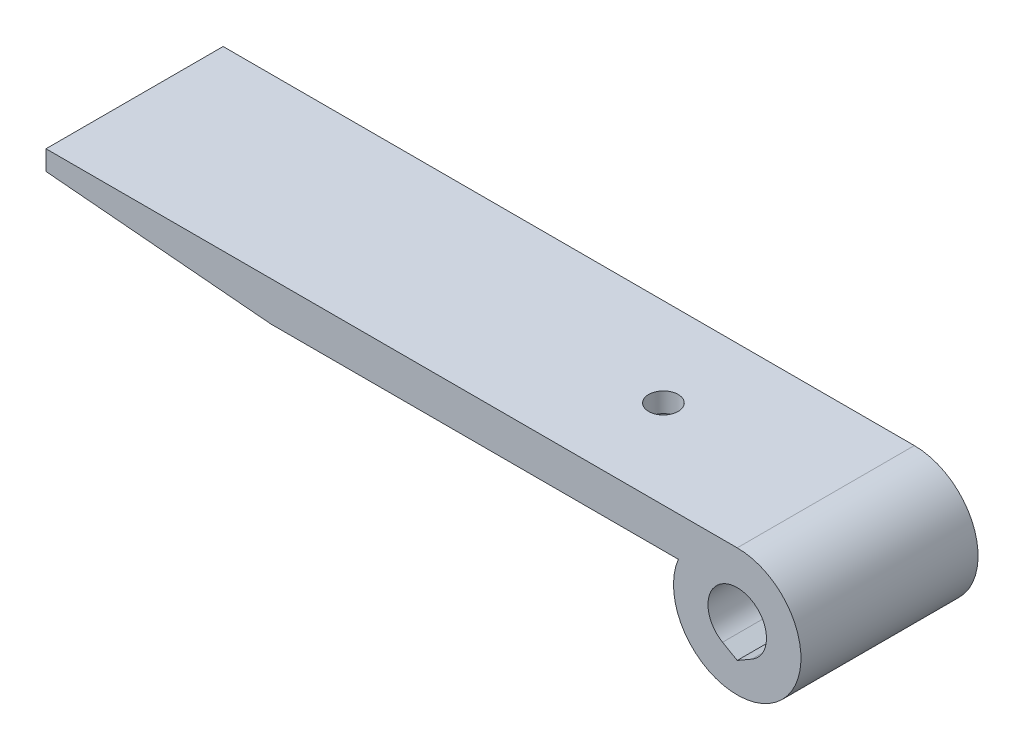
ISO-10303-21;
HEADER;
FILE_DESCRIPTION(('STEP AP214'),'2;1');
FILE_NAME('part.step','',(''),(''),'','','');
FILE_SCHEMA(('AUTOMOTIVE_DESIGN { 1 0 10303 214 1 1 1 1 }'));
ENDSEC;
DATA;
#1=APPLICATION_CONTEXT('core data for automotive mechanical design processes');
#2=APPLICATION_PROTOCOL_DEFINITION('international standard','automotive_design',2000,#1);
#3=PRODUCT_CONTEXT('',#1,'mechanical');
#4=PRODUCT('Part','Part','',(#3));
#5=PRODUCT_RELATED_PRODUCT_CATEGORY('part','',(#4));
#6=PRODUCT_DEFINITION_FORMATION('','',#4);
#7=PRODUCT_DEFINITION_CONTEXT('part definition',#1,'design');
#8=PRODUCT_DEFINITION('design','',#6,#7);
#9=PRODUCT_DEFINITION_SHAPE('','',#8);
#10=(LENGTH_UNIT() NAMED_UNIT(*) SI_UNIT(.MILLI.,.METRE.));
#11=(NAMED_UNIT(*) PLANE_ANGLE_UNIT() SI_UNIT($,.RADIAN.));
#12=(NAMED_UNIT(*) SI_UNIT($,.STERADIAN.) SOLID_ANGLE_UNIT());
#13=UNCERTAINTY_MEASURE_WITH_UNIT(LENGTH_MEASURE(1.E-05),#10,'distance_accuracy_value','');
#14=(GEOMETRIC_REPRESENTATION_CONTEXT(3) GLOBAL_UNCERTAINTY_ASSIGNED_CONTEXT((#13)) GLOBAL_UNIT_ASSIGNED_CONTEXT((#10,
#11,#12)) REPRESENTATION_CONTEXT('',''));
#15=CARTESIAN_POINT('',(0.,0.,0.));
#16=DIRECTION('',(0.,0.,1.));
#17=DIRECTION('',(1.,0.,0.));
#18=AXIS2_PLACEMENT_3D('',#15,#16,#17);
#19=CARTESIAN_POINT('',(0.,4.47499999999999,9.));
#20=DIRECTION('',(0.,1.,0.));
#21=DIRECTION('',(-1.,0.,0.));
#22=AXIS2_PLACEMENT_3D('',#19,#20,#21);
#23=PLANE('',#22);
#24=CARTESIAN_POINT('',(-16.5,4.47499999999999,0.));
#25=DIRECTION('',(0.,-1.,0.));
#26=DIRECTION('',(1.,0.,0.));
#27=AXIS2_PLACEMENT_3D('',#24,#25,#26);
#28=CIRCLE('',#27,1.5);
#29=CARTESIAN_POINT('',(-15.,4.47499999999999,0.));
#30=VERTEX_POINT('',#29);
#31=EDGE_CURVE('E256',#30,#30,#28,.T.);
#32=ORIENTED_EDGE('',*,*,#31,.F.);
#33=EDGE_LOOP('',(#32));
#34=FACE_BOUND('',#33,.T.);
#35=CARTESIAN_POINT('',(-16.5,4.47499999999999,0.));
#36=DIRECTION('',(0.,-1.,0.));
#37=DIRECTION('',(1.,0.,0.));
#38=AXIS2_PLACEMENT_3D('',#35,#36,#37);
#39=CIRCLE('',#38,4.05);
#40=CARTESIAN_POINT('',(-12.45,4.47499999999999,0.));
#41=VERTEX_POINT('',#40);
#42=EDGE_CURVE('E264',#41,#41,#39,.T.);
#43=ORIENTED_EDGE('',*,*,#42,.T.);
#44=EDGE_LOOP('',(#43));
#45=FACE_BOUND('',#44,.T.);
#46=ADVANCED_FACE('F38',(#34,#45),#23,.F.);
#47=CARTESIAN_POINT('',(0.,0.,9.));
#48=DIRECTION('',(0.,0.,-1.));
#49=DIRECTION('',(-1.,0.,0.));
#50=AXIS2_PLACEMENT_3D('',#47,#48,#49);
#51=CYLINDRICAL_SURFACE('',#50,6.475);
#52=DIRECTION('',(0.,0.,1.));
#53=VECTOR('',#52,1.);
#54=CARTESIAN_POINT('',(-5.98331012066064,2.47499999999999,7.));
#55=LINE('',#54,#53);
#56=CARTESIAN_POINT('',(-5.98331012066064,2.47499999999999,7.));
#57=VERTEX_POINT('',#56);
#58=CARTESIAN_POINT('',(-5.98331012066064,2.47499999999999,9.));
#59=VERTEX_POINT('',#58);
#60=EDGE_CURVE('E130',#57,#59,#55,.T.);
#61=ORIENTED_EDGE('',*,*,#60,.F.);
#62=CARTESIAN_POINT('',(0.,0.,7.));
#63=DIRECTION('',(0.,0.,1.));
#64=DIRECTION('',(1.,0.,0.));
#65=AXIS2_PLACEMENT_3D('',#62,#63,#64);
#66=CIRCLE('',#65,6.475);
#67=CARTESIAN_POINT('',(-4.67974358271905,4.47499999999999,7.));
#68=VERTEX_POINT('',#67);
#69=EDGE_CURVE('E137',#68,#57,#66,.T.);
#70=ORIENTED_EDGE('',*,*,#69,.F.);
#71=DIRECTION('',(0.,0.,-1.));
#72=VECTOR('',#71,1.);
#73=CARTESIAN_POINT('',(-4.67974358271905,4.47499999999999,9.));
#74=LINE('',#73,#72);
#75=CARTESIAN_POINT('',(-4.67974358271905,4.47499999999999,-7.));
#76=VERTEX_POINT('',#75);
#77=EDGE_CURVE('E46',#68,#76,#74,.T.);
#78=ORIENTED_EDGE('',*,*,#77,.T.);
#79=CARTESIAN_POINT('',(0.,0.,-7.));
#80=DIRECTION('',(0.,0.,1.));
#81=DIRECTION('',(1.,0.,0.));
#82=AXIS2_PLACEMENT_3D('',#79,#80,#81);
#83=CIRCLE('',#82,6.475);
#84=CARTESIAN_POINT('',(-5.98331012066064,2.47499999999999,-7.));
#85=VERTEX_POINT('',#84);
#86=EDGE_CURVE('E53',#76,#85,#83,.T.);
#87=ORIENTED_EDGE('',*,*,#86,.T.);
#88=DIRECTION('',(0.,0.,-1.));
#89=VECTOR('',#88,1.);
#90=CARTESIAN_POINT('',(-5.98331012066064,2.47499999999999,-7.));
#91=LINE('',#90,#89);
#92=CARTESIAN_POINT('',(-5.98331012066064,2.47499999999999,-9.));
#93=VERTEX_POINT('',#92);
#94=EDGE_CURVE('E169',#85,#93,#91,.T.);
#95=ORIENTED_EDGE('',*,*,#94,.T.);
#96=CARTESIAN_POINT('',(0.,0.,-9.));
#97=DIRECTION('',(0.,0.,1.));
#98=DIRECTION('',(1.,0.,0.));
#99=AXIS2_PLACEMENT_3D('',#96,#97,#98);
#100=CIRCLE('',#99,6.475);
#101=CARTESIAN_POINT('',(0.,6.475,-9.));
#102=VERTEX_POINT('',#101);
#103=EDGE_CURVE('E194',#93,#102,#100,.T.);
#104=ORIENTED_EDGE('',*,*,#103,.T.);
#105=DIRECTION('',(0.,0.,-1.));
#106=VECTOR('',#105,1.);
#107=CARTESIAN_POINT('',(0.,6.475,9.));
#108=LINE('',#107,#106);
#109=CARTESIAN_POINT('',(0.,6.475,9.));
#110=VERTEX_POINT('',#109);
#111=EDGE_CURVE('E206',#110,#102,#108,.T.);
#112=ORIENTED_EDGE('',*,*,#111,.F.);
#113=CARTESIAN_POINT('',(0.,0.,9.));
#114=DIRECTION('',(0.,0.,1.));
#115=DIRECTION('',(1.,0.,0.));
#116=AXIS2_PLACEMENT_3D('',#113,#114,#115);
#117=CIRCLE('',#116,6.475);
#118=EDGE_CURVE('E146',#59,#110,#117,.T.);
#119=ORIENTED_EDGE('',*,*,#118,.F.);
#120=EDGE_LOOP('',(#61,#70,#78,#87,#95,#104,#112,#119));
#121=FACE_BOUND('',#120,.T.);
#122=ADVANCED_FACE('F144',(#121),#51,.T.);
#123=CARTESIAN_POINT('',(-16.5,4.47499999999999,0.));
#124=DIRECTION('',(0.,1.,0.));
#125=DIRECTION('',(-1.,0.,0.));
#126=AXIS2_PLACEMENT_3D('',#123,#124,#125);
#127=CIRCLE('',#126,6.95);
#128=CARTESIAN_POINT('',(-23.45,4.47499999999999,0.));
#129=VERTEX_POINT('',#128);
#130=EDGE_CURVE('E11',#129,#129,#127,.F.);
#131=ORIENTED_EDGE('',*,*,#130,.F.);
#132=EDGE_LOOP('',(#131));
#133=FACE_BOUND('',#132,.T.);
#134=DIRECTION('',(-1.,0.,0.));
#135=VECTOR('',#134,1.);
#136=CARTESIAN_POINT('',(0.,4.47499999999999,7.));
#137=LINE('',#136,#135);
#138=CARTESIAN_POINT('',(-70.2404,4.47499999999999,7.));
#139=VERTEX_POINT('',#138);
#140=EDGE_CURVE('E141',#68,#139,#137,.T.);
#141=ORIENTED_EDGE('',*,*,#140,.T.);
#142=DIRECTION('',(0.,0.,-1.));
#143=VECTOR('',#142,1.);
#144=CARTESIAN_POINT('',(-70.2404,4.47499999999999,9.));
#145=LINE('',#144,#143);
#146=CARTESIAN_POINT('',(-70.2404,4.47499999999999,-7.));
#147=VERTEX_POINT('',#146);
#148=EDGE_CURVE('E203',#139,#147,#145,.T.);
#149=ORIENTED_EDGE('',*,*,#148,.T.);
#150=DIRECTION('',(1.,0.,0.));
#151=VECTOR('',#150,1.);
#152=CARTESIAN_POINT('',(0.,4.47499999999999,-7.));
#153=LINE('',#152,#151);
#154=EDGE_CURVE('E158',#147,#76,#153,.T.);
#155=ORIENTED_EDGE('',*,*,#154,.T.);
#156=ORIENTED_EDGE('',*,*,#77,.F.);
#157=EDGE_LOOP('',(#141,#149,#155,#156));
#158=FACE_BOUND('',#157,.T.);
#159=ADVANCED_FACE('F220',(#133,#158),#23,.F.);
#160=CARTESIAN_POINT('',(0.,6.475,9.));
#161=DIRECTION('',(0.,-1.,0.));
#162=DIRECTION('',(1.,0.,0.));
#163=AXIS2_PLACEMENT_3D('',#160,#161,#162);
#164=PLANE('',#163);
#165=CARTESIAN_POINT('',(-16.5,6.475,0.));
#166=DIRECTION('',(0.,-1.,0.));
#167=DIRECTION('',(1.,0.,0.));
#168=AXIS2_PLACEMENT_3D('',#165,#166,#167);
#169=CIRCLE('',#168,1.5);
#170=CARTESIAN_POINT('',(-15.,6.475,0.));
#171=VERTEX_POINT('',#170);
#172=EDGE_CURVE('E253',#171,#171,#169,.T.);
#173=ORIENTED_EDGE('',*,*,#172,.T.);
#174=EDGE_LOOP('',(#173));
#175=FACE_BOUND('',#174,.T.);
#176=DIRECTION('',(-1.,0.,0.));
#177=VECTOR('',#176,1.);
#178=CARTESIAN_POINT('',(0.,6.475,-9.));
#179=LINE('',#178,#177);
#180=CARTESIAN_POINT('',(-70.2404,6.47499999999999,-9.));
#181=VERTEX_POINT('',#180);
#182=EDGE_CURVE('E196',#102,#181,#179,.T.);
#183=ORIENTED_EDGE('',*,*,#182,.T.);
#184=DIRECTION('',(0.,0.,-1.));
#185=VECTOR('',#184,1.);
#186=CARTESIAN_POINT('',(-70.2404,6.47499999999999,9.));
#187=LINE('',#186,#185);
#188=CARTESIAN_POINT('',(-70.2404,6.47499999999999,9.));
#189=VERTEX_POINT('',#188);
#190=EDGE_CURVE('E202',#189,#181,#187,.T.);
#191=ORIENTED_EDGE('',*,*,#190,.F.);
#192=DIRECTION('',(-1.,0.,0.));
#193=VECTOR('',#192,1.);
#194=CARTESIAN_POINT('',(0.,6.475,9.));
#195=LINE('',#194,#193);
#196=EDGE_CURVE('E181',#110,#189,#195,.T.);
#197=ORIENTED_EDGE('',*,*,#196,.F.);
#198=ORIENTED_EDGE('',*,*,#111,.T.);
#199=EDGE_LOOP('',(#183,#191,#197,#198));
#200=FACE_BOUND('',#199,.T.);
#201=ADVANCED_FACE('F245',(#175,#200),#164,.F.);
#202=CARTESIAN_POINT('',(0.,0.,9.));
#203=DIRECTION('',(0.,0.,-1.));
#204=DIRECTION('',(-1.,0.,0.));
#205=AXIS2_PLACEMENT_3D('',#202,#203,#204);
#206=CYLINDRICAL_SURFACE('',#205,2.975);
#207=CARTESIAN_POINT('',(0.,0.,-9.));
#208=DIRECTION('',(0.,0.,1.));
#209=DIRECTION('',(1.,0.,0.));
#210=AXIS2_PLACEMENT_3D('',#207,#208,#209);
#211=CIRCLE('',#210,2.975);
#212=CARTESIAN_POINT('',(1.4875,-2.5764255762587,-9.));
#213=VERTEX_POINT('',#212);
#214=CARTESIAN_POINT('',(-1.4875,-2.5764255762587,-9.));
#215=VERTEX_POINT('',#214);
#216=EDGE_CURVE('E171',#213,#215,#211,.T.);
#217=ORIENTED_EDGE('',*,*,#216,.F.);
#218=DIRECTION('',(0.,0.,-1.));
#219=VECTOR('',#218,1.);
#220=CARTESIAN_POINT('',(1.4875,-2.5764255762587,9.));
#221=LINE('',#220,#219);
#222=CARTESIAN_POINT('',(1.4875,-2.5764255762587,9.));
#223=VERTEX_POINT('',#222);
#224=EDGE_CURVE('E213',#223,#213,#221,.T.);
#225=ORIENTED_EDGE('',*,*,#224,.F.);
#226=CARTESIAN_POINT('',(0.,0.,9.));
#227=DIRECTION('',(0.,0.,1.));
#228=DIRECTION('',(1.,0.,0.));
#229=AXIS2_PLACEMENT_3D('',#226,#227,#228);
#230=CIRCLE('',#229,2.975);
#231=CARTESIAN_POINT('',(-1.4875,-2.5764255762587,9.));
#232=VERTEX_POINT('',#231);
#233=EDGE_CURVE('E172',#223,#232,#230,.T.);
#234=ORIENTED_EDGE('',*,*,#233,.T.);
#235=DIRECTION('',(0.,0.,-1.));
#236=VECTOR('',#235,1.);
#237=CARTESIAN_POINT('',(-1.4875,-2.5764255762587,9.));
#238=LINE('',#237,#236);
#239=EDGE_CURVE('E186',#232,#215,#238,.T.);
#240=ORIENTED_EDGE('',*,*,#239,.T.);
#241=EDGE_LOOP('',(#217,#225,#234,#240));
#242=FACE_BOUND('',#241,.T.);
#243=ADVANCED_FACE('F40',(#242),#206,.F.);
#244=CARTESIAN_POINT('',(1.4875,-2.5764255762587,9.));
#245=DIRECTION('',(0.500000000000001,-0.866025403784438,0.));
#246=DIRECTION('',(0.866025403784438,0.500000000000001,0.));
#247=AXIS2_PLACEMENT_3D('',#244,#245,#246);
#248=PLANE('',#247);
#249=DIRECTION('',(-0.866025403784438,-0.500000000000001,0.));
#250=VECTOR('',#249,1.);
#251=CARTESIAN_POINT('',(1.4875,-2.5764255762587,-9.));
#252=LINE('',#251,#250);
#253=CARTESIAN_POINT('',(0.,-3.43523410167828,-9.));
#254=VERTEX_POINT('',#253);
#255=EDGE_CURVE('E189',#213,#254,#252,.T.);
#256=ORIENTED_EDGE('',*,*,#255,.T.);
#257=DIRECTION('',(0.,0.,-1.));
#258=VECTOR('',#257,1.);
#259=CARTESIAN_POINT('',(0.,-3.43523410167828,9.));
#260=LINE('',#259,#258);
#261=CARTESIAN_POINT('',(0.,-3.43523410167828,9.));
#262=VERTEX_POINT('',#261);
#263=EDGE_CURVE('E211',#262,#254,#260,.T.);
#264=ORIENTED_EDGE('',*,*,#263,.F.);
#265=DIRECTION('',(-0.866025403784438,-0.500000000000001,0.));
#266=VECTOR('',#265,1.);
#267=CARTESIAN_POINT('',(1.4875,-2.5764255762587,9.));
#268=LINE('',#267,#266);
#269=EDGE_CURVE('E175',#223,#262,#268,.T.);
#270=ORIENTED_EDGE('',*,*,#269,.F.);
#271=ORIENTED_EDGE('',*,*,#224,.T.);
#272=EDGE_LOOP('',(#256,#264,#270,#271));
#273=FACE_BOUND('',#272,.T.);
#274=ADVANCED_FACE('F337',(#273),#248,.F.);
#275=CARTESIAN_POINT('',(-1.4875,-2.5764255762587,9.));
#276=DIRECTION('',(-0.500000000000001,-0.866025403784438,0.));
#277=DIRECTION('',(0.866025403784438,-0.500000000000001,0.));
#278=AXIS2_PLACEMENT_3D('',#275,#276,#277);
#279=PLANE('',#278);
#280=DIRECTION('',(-0.866025403784438,0.500000000000001,0.));
#281=VECTOR('',#280,1.);
#282=CARTESIAN_POINT('',(-1.4875,-2.5764255762587,-9.));
#283=LINE('',#282,#281);
#284=EDGE_CURVE('E191',#254,#215,#283,.T.);
#285=ORIENTED_EDGE('',*,*,#284,.T.);
#286=ORIENTED_EDGE('',*,*,#239,.F.);
#287=DIRECTION('',(-0.866025403784438,0.500000000000001,0.));
#288=VECTOR('',#287,1.);
#289=CARTESIAN_POINT('',(-1.4875,-2.5764255762587,9.));
#290=LINE('',#289,#288);
#291=EDGE_CURVE('E178',#262,#232,#290,.T.);
#292=ORIENTED_EDGE('',*,*,#291,.F.);
#293=ORIENTED_EDGE('',*,*,#263,.T.);
#294=EDGE_LOOP('',(#285,#286,#292,#293));
#295=FACE_BOUND('',#294,.T.);
#296=ADVANCED_FACE('F333',(#295),#279,.F.);
#297=CARTESIAN_POINT('',(-70.2404,0.,9.));
#298=DIRECTION('',(1.,0.,0.));
#299=DIRECTION('',(0.,0.,-1.));
#300=AXIS2_PLACEMENT_3D('',#297,#298,#299);
#301=PLANE('',#300);
#302=DIRECTION('',(0.,-1.,0.));
#303=VECTOR('',#302,1.);
#304=CARTESIAN_POINT('',(-70.2404,0.,-9.));
#305=LINE('',#304,#303);
#306=CARTESIAN_POINT('',(-70.2404,4.47499999999999,-9.));
#307=VERTEX_POINT('',#306);
#308=EDGE_CURVE('E176',#181,#307,#305,.T.);
#309=ORIENTED_EDGE('',*,*,#308,.T.);
#310=DIRECTION('',(0.,0.,-1.));
#311=VECTOR('',#310,1.);
#312=CARTESIAN_POINT('',(-70.2404,4.47499999999999,-7.));
#313=LINE('',#312,#311);
#314=EDGE_CURVE('E166',#147,#307,#313,.T.);
#315=ORIENTED_EDGE('',*,*,#314,.F.);
#316=ORIENTED_EDGE('',*,*,#148,.F.);
#317=CARTESIAN_POINT('',(-70.2404,4.47499999999999,9.));
#318=VERTEX_POINT('',#317);
#319=EDGE_CURVE('E199',#318,#139,#145,.T.);
#320=ORIENTED_EDGE('',*,*,#319,.F.);
#321=DIRECTION('',(0.,-1.,0.));
#322=VECTOR('',#321,1.);
#323=CARTESIAN_POINT('',(-70.2404,0.,9.));
#324=LINE('',#323,#322);
#325=EDGE_CURVE('E183',#189,#318,#324,.T.);
#326=ORIENTED_EDGE('',*,*,#325,.F.);
#327=ORIENTED_EDGE('',*,*,#190,.T.);
#328=EDGE_LOOP('',(#309,#315,#316,#320,#326,#327));
#329=FACE_BOUND('',#328,.T.);
#330=ADVANCED_FACE('F225',(#329),#301,.F.);
#331=CARTESIAN_POINT('',(0.,0.,9.));
#332=DIRECTION('',(0.,0.,1.));
#333=DIRECTION('',(1.,0.,0.));
#334=AXIS2_PLACEMENT_3D('',#331,#332,#333);
#335=PLANE('',#334);
#336=DIRECTION('',(-1.,0.,0.));
#337=VECTOR('',#336,1.);
#338=CARTESIAN_POINT('',(0.,2.47499999999999,9.));
#339=LINE('',#338,#337);
#340=CARTESIAN_POINT('',(-47.3802953944774,2.47499999999999,9.));
#341=VERTEX_POINT('',#340);
#342=EDGE_CURVE('E252',#59,#341,#339,.T.);
#343=ORIENTED_EDGE('',*,*,#342,.F.);
#344=ORIENTED_EDGE('',*,*,#118,.T.);
#345=ORIENTED_EDGE('',*,*,#196,.T.);
#346=ORIENTED_EDGE('',*,*,#325,.T.);
#347=DIRECTION('',(-0.996194698091746,0.0871557427476583,0.));
#348=VECTOR('',#347,1.);
#349=CARTESIAN_POINT('',(-0.145016955130896,-1.65755138193333,9.));
#350=LINE('',#349,#348);
#351=EDGE_CURVE('E142',#341,#318,#350,.T.);
#352=ORIENTED_EDGE('',*,*,#351,.F.);
#353=EDGE_LOOP('',(#343,#344,#345,#346,#352));
#354=FACE_BOUND('',#353,.T.);
#355=ORIENTED_EDGE('',*,*,#233,.F.);
#356=ORIENTED_EDGE('',*,*,#269,.T.);
#357=ORIENTED_EDGE('',*,*,#291,.T.);
#358=EDGE_LOOP('',(#355,#356,#357));
#359=FACE_BOUND('',#358,.T.);
#360=ADVANCED_FACE('F250',(#354,#359),#335,.T.);
#361=CARTESIAN_POINT('',(0.,0.,-9.));
#362=DIRECTION('',(0.,0.,1.));
#363=DIRECTION('',(1.,0.,0.));
#364=AXIS2_PLACEMENT_3D('',#361,#362,#363);
#365=PLANE('',#364);
#366=ORIENTED_EDGE('',*,*,#103,.F.);
#367=DIRECTION('',(1.,0.,0.));
#368=VECTOR('',#367,1.);
#369=CARTESIAN_POINT('',(0.,2.47499999999999,-9.));
#370=LINE('',#369,#368);
#371=CARTESIAN_POINT('',(-47.3802953944774,2.47499999999999,-9.));
#372=VERTEX_POINT('',#371);
#373=EDGE_CURVE('E147',#372,#93,#370,.T.);
#374=ORIENTED_EDGE('',*,*,#373,.F.);
#375=DIRECTION('',(0.996194698091746,-0.0871557427476583,0.));
#376=VECTOR('',#375,1.);
#377=CARTESIAN_POINT('',(-0.145016955130896,-1.65755138193333,-9.));
#378=LINE('',#377,#376);
#379=EDGE_CURVE('E150',#307,#372,#378,.T.);
#380=ORIENTED_EDGE('',*,*,#379,.F.);
#381=ORIENTED_EDGE('',*,*,#308,.F.);
#382=ORIENTED_EDGE('',*,*,#182,.F.);
#383=EDGE_LOOP('',(#366,#374,#380,#381,#382));
#384=FACE_BOUND('',#383,.T.);
#385=ORIENTED_EDGE('',*,*,#216,.T.);
#386=ORIENTED_EDGE('',*,*,#284,.F.);
#387=ORIENTED_EDGE('',*,*,#255,.F.);
#388=EDGE_LOOP('',(#385,#386,#387));
#389=FACE_BOUND('',#388,.T.);
#390=ADVANCED_FACE('F241',(#384,#389),#365,.F.);
#391=CARTESIAN_POINT('',(0.,2.47499999999999,-7.));
#392=DIRECTION('',(0.,1.,0.));
#393=DIRECTION('',(0.,0.,1.));
#394=AXIS2_PLACEMENT_3D('',#391,#392,#393);
#395=PLANE('',#394);
#396=ORIENTED_EDGE('',*,*,#373,.T.);
#397=ORIENTED_EDGE('',*,*,#94,.F.);
#398=DIRECTION('',(1.,0.,0.));
#399=VECTOR('',#398,1.);
#400=CARTESIAN_POINT('',(0.,2.47499999999999,-7.));
#401=LINE('',#400,#399);
#402=CARTESIAN_POINT('',(-47.3802953944774,2.47499999999999,-7.));
#403=VERTEX_POINT('',#402);
#404=EDGE_CURVE('E155',#403,#85,#401,.T.);
#405=ORIENTED_EDGE('',*,*,#404,.F.);
#406=DIRECTION('',(0.,0.,-1.));
#407=VECTOR('',#406,1.);
#408=CARTESIAN_POINT('',(-47.3802953944774,2.47499999999999,-7.));
#409=LINE('',#408,#407);
#410=EDGE_CURVE('E161',#403,#372,#409,.T.);
#411=ORIENTED_EDGE('',*,*,#410,.T.);
#412=EDGE_LOOP('',(#396,#397,#405,#411));
#413=FACE_BOUND('',#412,.T.);
#414=ADVANCED_FACE('F236',(#413),#395,.F.);
#415=CARTESIAN_POINT('',(-0.145016955130896,-1.65755138193333,-7.));
#416=DIRECTION('',(0.0871557427476583,0.996194698091746,0.));
#417=DIRECTION('',(-0.996194698091746,0.0871557427476583,0.));
#418=AXIS2_PLACEMENT_3D('',#415,#416,#417);
#419=PLANE('',#418);
#420=ORIENTED_EDGE('',*,*,#379,.T.);
#421=ORIENTED_EDGE('',*,*,#410,.F.);
#422=DIRECTION('',(0.996194698091746,-0.0871557427476583,0.));
#423=VECTOR('',#422,1.);
#424=CARTESIAN_POINT('',(-0.145016955130896,-1.65755138193333,-7.));
#425=LINE('',#424,#423);
#426=EDGE_CURVE('E160',#147,#403,#425,.T.);
#427=ORIENTED_EDGE('',*,*,#426,.F.);
#428=ORIENTED_EDGE('',*,*,#314,.T.);
#429=EDGE_LOOP('',(#420,#421,#427,#428));
#430=FACE_BOUND('',#429,.T.);
#431=ADVANCED_FACE('F230',(#430),#419,.F.);
#432=CARTESIAN_POINT('',(0.,0.,-7.));
#433=DIRECTION('',(0.,0.,1.));
#434=DIRECTION('',(1.,0.,0.));
#435=AXIS2_PLACEMENT_3D('',#432,#433,#434);
#436=PLANE('',#435);
#437=ORIENTED_EDGE('',*,*,#404,.T.);
#438=ORIENTED_EDGE('',*,*,#86,.F.);
#439=ORIENTED_EDGE('',*,*,#154,.F.);
#440=ORIENTED_EDGE('',*,*,#426,.T.);
#441=EDGE_LOOP('',(#437,#438,#439,#440));
#442=FACE_BOUND('',#441,.T.);
#443=ADVANCED_FACE('F233',(#442),#436,.T.);
#444=CARTESIAN_POINT('',(0.,2.47499999999999,7.));
#445=DIRECTION('',(0.,1.,0.));
#446=DIRECTION('',(0.,0.,1.));
#447=AXIS2_PLACEMENT_3D('',#444,#445,#446);
#448=PLANE('',#447);
#449=ORIENTED_EDGE('',*,*,#342,.T.);
#450=DIRECTION('',(0.,0.,1.));
#451=VECTOR('',#450,1.);
#452=CARTESIAN_POINT('',(-47.3802953944774,2.47499999999999,7.));
#453=LINE('',#452,#451);
#454=CARTESIAN_POINT('',(-47.3802953944774,2.47499999999999,7.));
#455=VERTEX_POINT('',#454);
#456=EDGE_CURVE('E133',#455,#341,#453,.T.);
#457=ORIENTED_EDGE('',*,*,#456,.F.);
#458=DIRECTION('',(-1.,0.,0.));
#459=VECTOR('',#458,1.);
#460=CARTESIAN_POINT('',(0.,2.47499999999999,7.));
#461=LINE('',#460,#459);
#462=EDGE_CURVE('E126',#57,#455,#461,.T.);
#463=ORIENTED_EDGE('',*,*,#462,.F.);
#464=ORIENTED_EDGE('',*,*,#60,.T.);
#465=EDGE_LOOP('',(#449,#457,#463,#464));
#466=FACE_BOUND('',#465,.T.);
#467=ADVANCED_FACE('F128',(#466),#448,.F.);
#468=CARTESIAN_POINT('',(-0.145016955130896,-1.65755138193333,7.));
#469=DIRECTION('',(0.0871557427476583,0.996194698091746,0.));
#470=DIRECTION('',(-0.996194698091746,0.0871557427476583,0.));
#471=AXIS2_PLACEMENT_3D('',#468,#469,#470);
#472=PLANE('',#471);
#473=ORIENTED_EDGE('',*,*,#351,.T.);
#474=ORIENTED_EDGE('',*,*,#319,.T.);
#475=DIRECTION('',(-0.996194698091746,0.0871557427476583,0.));
#476=VECTOR('',#475,1.);
#477=CARTESIAN_POINT('',(-0.145016955130896,-1.65755138193333,7.));
#478=LINE('',#477,#476);
#479=EDGE_CURVE('E136',#455,#139,#478,.T.);
#480=ORIENTED_EDGE('',*,*,#479,.F.);
#481=ORIENTED_EDGE('',*,*,#456,.T.);
#482=EDGE_LOOP('',(#473,#474,#480,#481));
#483=FACE_BOUND('',#482,.T.);
#484=ADVANCED_FACE('F316',(#483),#472,.F.);
#485=CARTESIAN_POINT('',(0.,0.,7.));
#486=DIRECTION('',(0.,0.,1.));
#487=DIRECTION('',(1.,0.,0.));
#488=AXIS2_PLACEMENT_3D('',#485,#486,#487);
#489=PLANE('',#488);
#490=ORIENTED_EDGE('',*,*,#69,.T.);
#491=ORIENTED_EDGE('',*,*,#462,.T.);
#492=ORIENTED_EDGE('',*,*,#479,.T.);
#493=ORIENTED_EDGE('',*,*,#140,.F.);
#494=EDGE_LOOP('',(#490,#491,#492,#493));
#495=FACE_BOUND('',#494,.T.);
#496=ADVANCED_FACE('F139',(#495),#489,.F.);
#497=CARTESIAN_POINT('',(-16.5,6.475,0.));
#498=DIRECTION('',(0.,-1.,0.));
#499=DIRECTION('',(1.,0.,0.));
#500=AXIS2_PLACEMENT_3D('',#497,#498,#499);
#501=CYLINDRICAL_SURFACE('',#500,1.5);
#502=ORIENTED_EDGE('',*,*,#172,.F.);
#503=EDGE_LOOP('',(#502));
#504=FACE_BOUND('',#503,.T.);
#505=ORIENTED_EDGE('',*,*,#31,.T.);
#506=EDGE_LOOP('',(#505));
#507=FACE_BOUND('',#506,.T.);
#508=ADVANCED_FACE('F306',(#504,#507),#501,.F.);
#509=CARTESIAN_POINT('',(-16.5,0.47499999999999,0.));
#510=DIRECTION('',(0.,1.,0.));
#511=DIRECTION('',(-1.,0.,0.));
#512=AXIS2_PLACEMENT_3D('',#509,#510,#511);
#513=CYLINDRICAL_SURFACE('',#512,4.05);
#514=CARTESIAN_POINT('',(-16.5,0.47499999999999,0.));
#515=DIRECTION('',(0.,-1.,0.));
#516=DIRECTION('',(1.,0.,0.));
#517=AXIS2_PLACEMENT_3D('',#514,#515,#516);
#518=CIRCLE('',#517,4.05);
#519=CARTESIAN_POINT('',(-12.45,0.47499999999999,0.));
#520=VERTEX_POINT('',#519);
#521=EDGE_CURVE('E267',#520,#520,#518,.T.);
#522=ORIENTED_EDGE('',*,*,#521,.T.);
#523=EDGE_LOOP('',(#522));
#524=FACE_BOUND('',#523,.T.);
#525=ORIENTED_EDGE('',*,*,#42,.F.);
#526=EDGE_LOOP('',(#525));
#527=FACE_BOUND('',#526,.T.);
#528=ADVANCED_FACE('F273',(#524,#527),#513,.F.);
#529=CARTESIAN_POINT('',(-16.5,0.47499999999999,0.));
#530=DIRECTION('',(0.,1.,0.));
#531=DIRECTION('',(-1.,0.,0.));
#532=AXIS2_PLACEMENT_3D('',#529,#530,#531);
#533=CYLINDRICAL_SURFACE('',#532,6.95);
#534=CARTESIAN_POINT('',(-16.5,0.47499999999999,0.));
#535=DIRECTION('',(0.,-1.,0.));
#536=DIRECTION('',(1.,0.,0.));
#537=AXIS2_PLACEMENT_3D('',#534,#535,#536);
#538=CIRCLE('',#537,6.95);
#539=CARTESIAN_POINT('',(-9.55,0.47499999999999,0.));
#540=VERTEX_POINT('',#539);
#541=EDGE_CURVE('E262',#540,#540,#538,.T.);
#542=ORIENTED_EDGE('',*,*,#541,.F.);
#543=EDGE_LOOP('',(#542));
#544=FACE_BOUND('',#543,.T.);
#545=ORIENTED_EDGE('',*,*,#130,.T.);
#546=EDGE_LOOP('',(#545));
#547=FACE_BOUND('',#546,.T.);
#548=ADVANCED_FACE('F279',(#544,#547),#533,.T.);
#549=CARTESIAN_POINT('',(0.,0.47499999999999,0.));
#550=DIRECTION('',(0.,-1.,0.));
#551=DIRECTION('',(1.,0.,0.));
#552=AXIS2_PLACEMENT_3D('',#549,#550,#551);
#553=PLANE('',#552);
#554=ORIENTED_EDGE('',*,*,#521,.F.);
#555=EDGE_LOOP('',(#554));
#556=FACE_BOUND('',#555,.T.);
#557=ORIENTED_EDGE('',*,*,#541,.T.);
#558=EDGE_LOOP('',(#557));
#559=FACE_BOUND('',#558,.T.);
#560=ADVANCED_FACE('F276',(#556,#559),#553,.T.);
#561=CLOSED_SHELL('',(#46,#122,#159,#201,#243,#274,#296,#330,#360,#390,#414,#431,#443,#467,#484,
#496,#508,#528,#548,#560));
#562=MANIFOLD_SOLID_BREP('B2',#561);
#563=ADVANCED_BREP_SHAPE_REPRESENTATION('',(#18,#562),#14);
#564=SHAPE_DEFINITION_REPRESENTATION(#9,#563);
ENDSEC;
END-ISO-10303-21;
